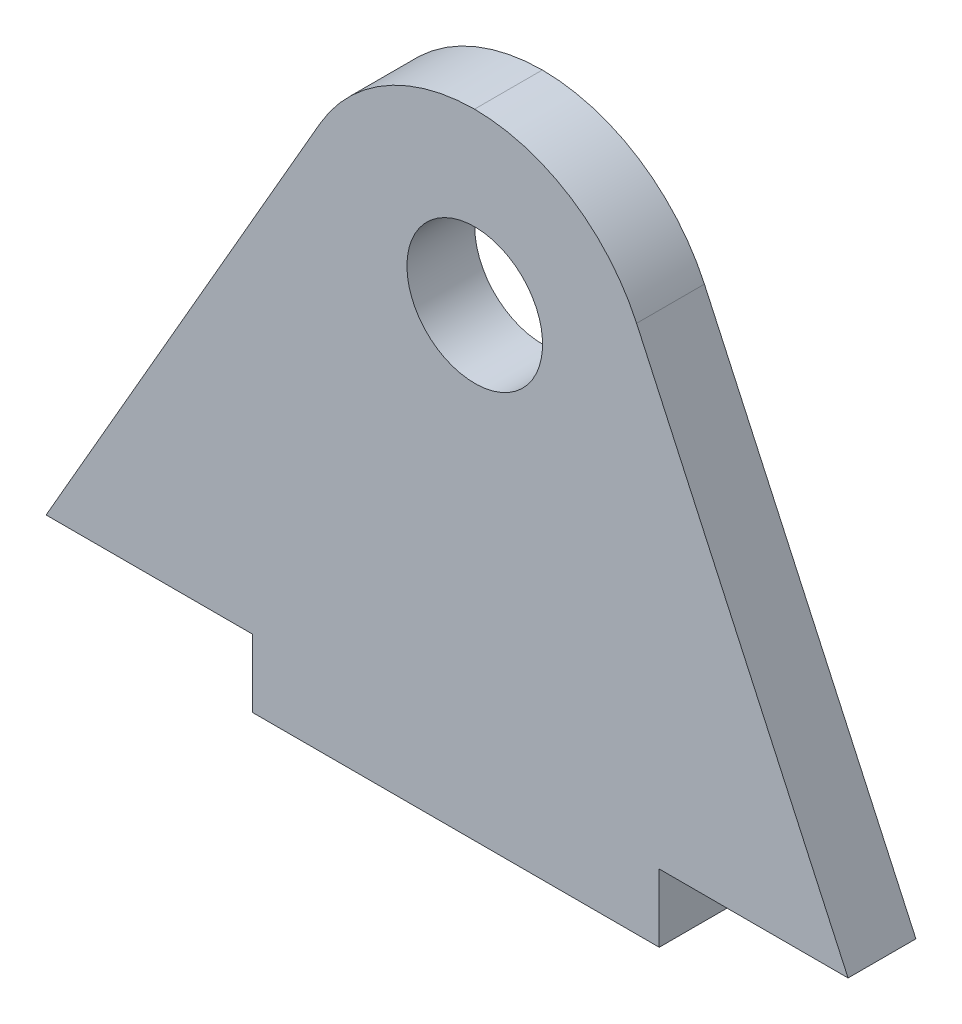
ISO-10303-21;
HEADER;
FILE_DESCRIPTION(('STEP AP214'),'2;1');
FILE_NAME('part.step','',(''),(''),'','','');
FILE_SCHEMA(('AUTOMOTIVE_DESIGN { 1 0 10303 214 1 1 1 1 }'));
ENDSEC;
DATA;
#1=APPLICATION_CONTEXT('core data for automotive mechanical design processes');
#2=APPLICATION_PROTOCOL_DEFINITION('international standard','automotive_design',2000,#1);
#3=PRODUCT_CONTEXT('',#1,'mechanical');
#4=PRODUCT('Part','Part','',(#3));
#5=PRODUCT_RELATED_PRODUCT_CATEGORY('part','',(#4));
#6=PRODUCT_DEFINITION_FORMATION('','',#4);
#7=PRODUCT_DEFINITION_CONTEXT('part definition',#1,'design');
#8=PRODUCT_DEFINITION('design','',#6,#7);
#9=PRODUCT_DEFINITION_SHAPE('','',#8);
#10=(LENGTH_UNIT() NAMED_UNIT(*) SI_UNIT(.MILLI.,.METRE.));
#11=(NAMED_UNIT(*) PLANE_ANGLE_UNIT() SI_UNIT($,.RADIAN.));
#12=(NAMED_UNIT(*) SI_UNIT($,.STERADIAN.) SOLID_ANGLE_UNIT());
#13=UNCERTAINTY_MEASURE_WITH_UNIT(LENGTH_MEASURE(1.E-05),#10,'distance_accuracy_value','');
#14=(GEOMETRIC_REPRESENTATION_CONTEXT(3) GLOBAL_UNCERTAINTY_ASSIGNED_CONTEXT((#13)) GLOBAL_UNIT_ASSIGNED_CONTEXT((#10,
#11,#12)) REPRESENTATION_CONTEXT('',''));
#15=CARTESIAN_POINT('',(0.,0.,0.));
#16=DIRECTION('',(0.,0.,1.));
#17=DIRECTION('',(1.,0.,0.));
#18=AXIS2_PLACEMENT_3D('',#15,#16,#17);
#19=CARTESIAN_POINT('',(-62.178178995026,0.,3.175));
#20=DIRECTION('',(0.,1.,0.));
#21=DIRECTION('',(0.,0.,1.));
#22=AXIS2_PLACEMENT_3D('',#19,#20,#21);
#23=PLANE('',#22);
#24=DIRECTION('',(0.,0.,-1.));
#25=VECTOR('',#24,1.);
#26=CARTESIAN_POINT('',(-52.526178995026,0.,3.175));
#27=LINE('',#26,#25);
#28=CARTESIAN_POINT('',(-52.526178995026,0.,3.175));
#29=VERTEX_POINT('',#28);
#30=CARTESIAN_POINT('',(-52.526178995026,0.,0.));
#31=VERTEX_POINT('',#30);
#32=EDGE_CURVE('E198',#29,#31,#27,.T.);
#33=ORIENTED_EDGE('',*,*,#32,.F.);
#34=DIRECTION('',(1.,0.,0.));
#35=VECTOR('',#34,1.);
#36=CARTESIAN_POINT('',(-62.178178995026,0.,3.175));
#37=LINE('',#36,#35);
#38=CARTESIAN_POINT('',(-62.178178995026,0.,3.175));
#39=VERTEX_POINT('',#38);
#40=EDGE_CURVE('E127',#39,#29,#37,.T.);
#41=ORIENTED_EDGE('',*,*,#40,.F.);
#42=DIRECTION('',(0.,0.,-1.));
#43=VECTOR('',#42,1.);
#44=CARTESIAN_POINT('',(-62.178178995026,0.,3.175));
#45=LINE('',#44,#43);
#46=CARTESIAN_POINT('',(-62.178178995026,0.,0.));
#47=VERTEX_POINT('',#46);
#48=EDGE_CURVE('E131',#39,#47,#45,.T.);
#49=ORIENTED_EDGE('',*,*,#48,.T.);
#50=DIRECTION('',(1.,0.,0.));
#51=VECTOR('',#50,1.);
#52=CARTESIAN_POINT('',(-62.178178995026,0.,0.));
#53=LINE('',#52,#51);
#54=EDGE_CURVE('E128',#47,#31,#53,.T.);
#55=ORIENTED_EDGE('',*,*,#54,.T.);
#56=EDGE_LOOP('',(#33,#41,#49,#55));
#57=FACE_BOUND('',#56,.T.);
#58=ADVANCED_FACE('F34',(#57),#23,.F.);
#59=CARTESIAN_POINT('',(-33.476178995026,0.,3.175));
#60=VERTEX_POINT('',#59);
#61=CARTESIAN_POINT('',(-24.636978995026,0.,3.175));
#62=VERTEX_POINT('',#61);
#63=EDGE_CURVE('E116',#60,#62,#37,.T.);
#64=ORIENTED_EDGE('',*,*,#63,.F.);
#65=DIRECTION('',(0.,0.,-1.));
#66=VECTOR('',#65,1.);
#67=CARTESIAN_POINT('',(-33.476178995026,0.,3.175));
#68=LINE('',#67,#66);
#69=CARTESIAN_POINT('',(-33.476178995026,0.,0.));
#70=VERTEX_POINT('',#69);
#71=EDGE_CURVE('E104',#60,#70,#68,.T.);
#72=ORIENTED_EDGE('',*,*,#71,.T.);
#73=CARTESIAN_POINT('',(-24.636978995026,0.,0.));
#74=VERTEX_POINT('',#73);
#75=EDGE_CURVE('E133',#70,#74,#53,.T.);
#76=ORIENTED_EDGE('',*,*,#75,.T.);
#77=DIRECTION('',(0.,0.,-1.));
#78=VECTOR('',#77,1.);
#79=CARTESIAN_POINT('',(-24.636978995026,0.,3.175));
#80=LINE('',#79,#78);
#81=EDGE_CURVE('E126',#62,#74,#80,.T.);
#82=ORIENTED_EDGE('',*,*,#81,.F.);
#83=EDGE_LOOP('',(#64,#72,#76,#82));
#84=FACE_BOUND('',#83,.T.);
#85=ADVANCED_FACE('F124',(#84),#23,.F.);
#86=CARTESIAN_POINT('',(0.,0.,3.175));
#87=DIRECTION('',(0.,0.,1.));
#88=DIRECTION('',(1.,0.,0.));
#89=AXIS2_PLACEMENT_3D('',#86,#87,#88);
#90=PLANE('',#89);
#91=CARTESIAN_POINT('',(-42.1121789950262,18.542,3.175));
#92=DIRECTION('',(0.,0.,-1.));
#93=DIRECTION('',(-1.,0.,0.));
#94=AXIS2_PLACEMENT_3D('',#91,#92,#93);
#95=CIRCLE('',#94,3.175);
#96=CARTESIAN_POINT('',(-45.2871789950262,18.542,3.175));
#97=VERTEX_POINT('',#96);
#98=EDGE_CURVE('E136',#97,#97,#95,.T.);
#99=ORIENTED_EDGE('',*,*,#98,.T.);
#100=EDGE_LOOP('',(#99));
#101=FACE_BOUND('',#100,.T.);
#102=CARTESIAN_POINT('',(-42.1560142519049,18.0975,3.175));
#103=DIRECTION('',(0.,0.,1.));
#104=DIRECTION('',(1.,0.,0.));
#105=AXIS2_PLACEMENT_3D('',#102,#103,#104);
#106=CIRCLE('',#105,8.382);
#107=CARTESIAN_POINT('',(-34.5367520406581,21.5910322177227,3.175));
#108=VERTEX_POINT('',#107);
#109=CARTESIAN_POINT('',(-42.123622855727,26.4794374131196,3.175));
#110=VERTEX_POINT('',#109);
#111=EDGE_CURVE('E58',#108,#110,#106,.T.);
#112=ORIENTED_EDGE('',*,*,#111,.T.);
#113=CARTESIAN_POINT('',(-42.0912314595492,18.0975,3.175));
#114=DIRECTION('',(0.,0.,1.));
#115=DIRECTION('',(1.,0.,0.));
#116=AXIS2_PLACEMENT_3D('',#113,#114,#115);
#117=CIRCLE('',#116,8.382);
#118=CARTESIAN_POINT('',(-49.3559456360177,22.2786304612769,3.175));
#119=VERTEX_POINT('',#118);
#120=EDGE_CURVE('E43',#110,#119,#117,.T.);
#121=ORIENTED_EDGE('',*,*,#120,.T.);
#122=DIRECTION('',(0.498822531767699,0.866704148946377,0.));
#123=VECTOR('',#122,1.);
#124=CARTESIAN_POINT('',(-46.7067608709964,26.8815889905015,3.175));
#125=LINE('',#124,#123);
#126=EDGE_CURVE('E152',#39,#119,#125,.T.);
#127=ORIENTED_EDGE('',*,*,#126,.F.);
#128=ORIENTED_EDGE('',*,*,#40,.T.);
#129=DIRECTION('',(0.,1.,0.));
#130=VECTOR('',#129,1.);
#131=CARTESIAN_POINT('',(-52.526178995026,-3.175,3.175));
#132=LINE('',#131,#130);
#133=CARTESIAN_POINT('',(-52.526178995026,-3.175,3.175));
#134=VERTEX_POINT('',#133);
#135=EDGE_CURVE('E112',#134,#29,#132,.T.);
#136=ORIENTED_EDGE('',*,*,#135,.F.);
#137=DIRECTION('',(-1.,0.,0.));
#138=VECTOR('',#137,1.);
#139=CARTESIAN_POINT('',(-33.476178995026,-3.175,3.175));
#140=LINE('',#139,#138);
#141=CARTESIAN_POINT('',(-33.476178995026,-3.175,3.175));
#142=VERTEX_POINT('',#141);
#143=EDGE_CURVE('E120',#142,#134,#140,.T.);
#144=ORIENTED_EDGE('',*,*,#143,.F.);
#145=DIRECTION('',(0.,-1.,0.));
#146=VECTOR('',#145,1.);
#147=CARTESIAN_POINT('',(-33.476178995026,0.,3.175));
#148=LINE('',#147,#146);
#149=EDGE_CURVE('E107',#60,#142,#148,.T.);
#150=ORIENTED_EDGE('',*,*,#149,.F.);
#151=ORIENTED_EDGE('',*,*,#63,.T.);
#152=DIRECTION('',(0.416789813615217,-0.909002888480886,0.));
#153=VECTOR('',#152,1.);
#154=CARTESIAN_POINT('',(-20.3571970163338,-9.33404333218952,3.175));
#155=LINE('',#154,#153);
#156=EDGE_CURVE('E160',#108,#62,#155,.T.);
#157=ORIENTED_EDGE('',*,*,#156,.F.);
#158=EDGE_LOOP('',(#112,#121,#127,#128,#136,#144,#150,#151,#157));
#159=FACE_BOUND('',#158,.T.);
#160=ADVANCED_FACE('F115',(#101,#159),#90,.T.);
#161=CARTESIAN_POINT('',(0.,0.,0.));
#162=DIRECTION('',(0.,0.,1.));
#163=DIRECTION('',(1.,0.,0.));
#164=AXIS2_PLACEMENT_3D('',#161,#162,#163);
#165=PLANE('',#164);
#166=CARTESIAN_POINT('',(-42.1121789950262,18.542,0.));
#167=DIRECTION('',(0.,0.,-1.));
#168=DIRECTION('',(-1.,0.,0.));
#169=AXIS2_PLACEMENT_3D('',#166,#167,#168);
#170=CIRCLE('',#169,3.17499999999999);
#171=CARTESIAN_POINT('',(-45.2871789950262,18.542,0.));
#172=VERTEX_POINT('',#171);
#173=EDGE_CURVE('E180',#172,#172,#170,.T.);
#174=ORIENTED_EDGE('',*,*,#173,.F.);
#175=EDGE_LOOP('',(#174));
#176=FACE_BOUND('',#175,.T.);
#177=DIRECTION('',(0.498822531767699,0.866704148946377,0.));
#178=VECTOR('',#177,1.);
#179=CARTESIAN_POINT('',(-46.7067608709964,26.8815889905015,0.));
#180=LINE('',#179,#178);
#181=CARTESIAN_POINT('',(-49.3559456360177,22.2786304612769,0.));
#182=VERTEX_POINT('',#181);
#183=EDGE_CURVE('E169',#47,#182,#180,.T.);
#184=ORIENTED_EDGE('',*,*,#183,.T.);
#185=CARTESIAN_POINT('',(-42.0912314595492,18.0975,0.));
#186=DIRECTION('',(0.,0.,1.));
#187=DIRECTION('',(1.,0.,0.));
#188=AXIS2_PLACEMENT_3D('',#185,#186,#187);
#189=CIRCLE('',#188,8.382);
#190=CARTESIAN_POINT('',(-42.123622855727,26.4794374131196,0.));
#191=VERTEX_POINT('',#190);
#192=EDGE_CURVE('E146',#182,#191,#189,.F.);
#193=ORIENTED_EDGE('',*,*,#192,.T.);
#194=CARTESIAN_POINT('',(-42.1560142519049,18.0975,0.));
#195=DIRECTION('',(0.,0.,1.));
#196=DIRECTION('',(1.,0.,0.));
#197=AXIS2_PLACEMENT_3D('',#194,#195,#196);
#198=CIRCLE('',#197,8.382);
#199=CARTESIAN_POINT('',(-34.5367520406581,21.5910322177227,0.));
#200=VERTEX_POINT('',#199);
#201=EDGE_CURVE('E144',#191,#200,#198,.F.);
#202=ORIENTED_EDGE('',*,*,#201,.T.);
#203=DIRECTION('',(0.416789813615217,-0.909002888480886,0.));
#204=VECTOR('',#203,1.);
#205=CARTESIAN_POINT('',(-20.3571970163338,-9.33404333218952,0.));
#206=LINE('',#205,#204);
#207=EDGE_CURVE('E174',#200,#74,#206,.T.);
#208=ORIENTED_EDGE('',*,*,#207,.T.);
#209=ORIENTED_EDGE('',*,*,#75,.F.);
#210=DIRECTION('',(0.,-1.,0.));
#211=VECTOR('',#210,1.);
#212=CARTESIAN_POINT('',(-33.476178995026,0.,0.));
#213=LINE('',#212,#211);
#214=CARTESIAN_POINT('',(-33.476178995026,-3.175,0.));
#215=VERTEX_POINT('',#214);
#216=EDGE_CURVE('E50',#70,#215,#213,.T.);
#217=ORIENTED_EDGE('',*,*,#216,.T.);
#218=DIRECTION('',(-1.,0.,0.));
#219=VECTOR('',#218,1.);
#220=CARTESIAN_POINT('',(-33.476178995026,-3.175,0.));
#221=LINE('',#220,#219);
#222=CARTESIAN_POINT('',(-52.526178995026,-3.175,0.));
#223=VERTEX_POINT('',#222);
#224=EDGE_CURVE('E190',#215,#223,#221,.T.);
#225=ORIENTED_EDGE('',*,*,#224,.T.);
#226=DIRECTION('',(0.,1.,0.));
#227=VECTOR('',#226,1.);
#228=CARTESIAN_POINT('',(-52.526178995026,-3.175,0.));
#229=LINE('',#228,#227);
#230=EDGE_CURVE('E121',#223,#31,#229,.T.);
#231=ORIENTED_EDGE('',*,*,#230,.T.);
#232=ORIENTED_EDGE('',*,*,#54,.F.);
#233=EDGE_LOOP('',(#184,#193,#202,#208,#209,#217,#225,#231,#232));
#234=FACE_BOUND('',#233,.T.);
#235=ADVANCED_FACE('F165',(#176,#234),#165,.F.);
#236=CARTESIAN_POINT('',(-42.1121789950262,18.542,0.));
#237=DIRECTION('',(0.,0.,-1.));
#238=DIRECTION('',(-1.,0.,0.));
#239=AXIS2_PLACEMENT_3D('',#236,#237,#238);
#240=CYLINDRICAL_SURFACE('',#239,3.17499999999999);
#241=ORIENTED_EDGE('',*,*,#98,.F.);
#242=EDGE_LOOP('',(#241));
#243=FACE_BOUND('',#242,.T.);
#244=ORIENTED_EDGE('',*,*,#173,.T.);
#245=EDGE_LOOP('',(#244));
#246=FACE_BOUND('',#245,.T.);
#247=ADVANCED_FACE('F227',(#243,#246),#240,.F.);
#248=CARTESIAN_POINT('',(-20.3571970163338,-9.33404333218952,3.175));
#249=DIRECTION('',(0.909002888480886,0.416789813615217,0.));
#250=DIRECTION('',(-0.416789813615217,0.909002888480886,0.));
#251=AXIS2_PLACEMENT_3D('',#248,#249,#250);
#252=PLANE('',#251);
#253=ORIENTED_EDGE('',*,*,#207,.F.);
#254=DIRECTION('',(0.,0.,-1.));
#255=VECTOR('',#254,1.);
#256=CARTESIAN_POINT('',(-34.5367520406581,21.5910322177227,3.175));
#257=LINE('',#256,#255);
#258=EDGE_CURVE('E11',#200,#108,#257,.F.);
#259=ORIENTED_EDGE('',*,*,#258,.T.);
#260=ORIENTED_EDGE('',*,*,#156,.T.);
#261=ORIENTED_EDGE('',*,*,#81,.T.);
#262=EDGE_LOOP('',(#253,#259,#260,#261));
#263=FACE_BOUND('',#262,.T.);
#264=ADVANCED_FACE('F173',(#263),#252,.T.);
#265=CARTESIAN_POINT('',(-46.7067608709964,26.8815889905015,3.175));
#266=DIRECTION('',(-0.866704148946377,0.498822531767699,0.));
#267=DIRECTION('',(-0.498822531767699,-0.866704148946377,0.));
#268=AXIS2_PLACEMENT_3D('',#265,#266,#267);
#269=PLANE('',#268);
#270=ORIENTED_EDGE('',*,*,#126,.T.);
#271=DIRECTION('',(0.,0.,-1.));
#272=VECTOR('',#271,1.);
#273=CARTESIAN_POINT('',(-49.3559456360177,22.2786304612768,3.175));
#274=LINE('',#273,#272);
#275=EDGE_CURVE('E141',#119,#182,#274,.T.);
#276=ORIENTED_EDGE('',*,*,#275,.T.);
#277=ORIENTED_EDGE('',*,*,#183,.F.);
#278=ORIENTED_EDGE('',*,*,#48,.F.);
#279=EDGE_LOOP('',(#270,#276,#277,#278));
#280=FACE_BOUND('',#279,.T.);
#281=ADVANCED_FACE('F158',(#280),#269,.T.);
#282=CARTESIAN_POINT('',(-42.1560142519049,18.0975,3.175));
#283=DIRECTION('',(0.,0.,-1.));
#284=DIRECTION('',(-1.,0.,0.));
#285=AXIS2_PLACEMENT_3D('',#282,#283,#284);
#286=CYLINDRICAL_SURFACE('',#285,8.382);
#287=DIRECTION('',(0.,0.,-1.));
#288=VECTOR('',#287,1.);
#289=CARTESIAN_POINT('',(-42.123622855727,26.4794374131196,1.5875));
#290=LINE('',#289,#288);
#291=EDGE_CURVE('E38',#110,#191,#290,.T.);
#292=ORIENTED_EDGE('',*,*,#291,.F.);
#293=ORIENTED_EDGE('',*,*,#111,.F.);
#294=ORIENTED_EDGE('',*,*,#258,.F.);
#295=ORIENTED_EDGE('',*,*,#201,.F.);
#296=EDGE_LOOP('',(#292,#293,#294,#295));
#297=FACE_BOUND('',#296,.T.);
#298=ADVANCED_FACE('F36',(#297),#286,.T.);
#299=CARTESIAN_POINT('',(-42.0912314595492,18.0975,3.175));
#300=DIRECTION('',(0.,0.,-1.));
#301=DIRECTION('',(-1.,0.,0.));
#302=AXIS2_PLACEMENT_3D('',#299,#300,#301);
#303=CYLINDRICAL_SURFACE('',#302,8.382);
#304=ORIENTED_EDGE('',*,*,#120,.F.);
#305=ORIENTED_EDGE('',*,*,#291,.T.);
#306=ORIENTED_EDGE('',*,*,#192,.F.);
#307=ORIENTED_EDGE('',*,*,#275,.F.);
#308=EDGE_LOOP('',(#304,#305,#306,#307));
#309=FACE_BOUND('',#308,.T.);
#310=ADVANCED_FACE('F162',(#309),#303,.T.);
#311=CARTESIAN_POINT('',(-52.526178995026,-3.175,3.175));
#312=DIRECTION('',(-1.,0.,0.));
#313=DIRECTION('',(0.,-1.,0.));
#314=AXIS2_PLACEMENT_3D('',#311,#312,#313);
#315=PLANE('',#314);
#316=ORIENTED_EDGE('',*,*,#230,.F.);
#317=DIRECTION('',(0.,0.,-1.));
#318=VECTOR('',#317,1.);
#319=CARTESIAN_POINT('',(-52.526178995026,-3.175,3.175));
#320=LINE('',#319,#318);
#321=EDGE_CURVE('E200',#134,#223,#320,.T.);
#322=ORIENTED_EDGE('',*,*,#321,.F.);
#323=ORIENTED_EDGE('',*,*,#135,.T.);
#324=ORIENTED_EDGE('',*,*,#32,.T.);
#325=EDGE_LOOP('',(#316,#322,#323,#324));
#326=FACE_BOUND('',#325,.T.);
#327=ADVANCED_FACE('F204',(#326),#315,.T.);
#328=CARTESIAN_POINT('',(-33.476178995026,-3.175,3.175));
#329=DIRECTION('',(0.,-1.,0.));
#330=DIRECTION('',(0.,0.,-1.));
#331=AXIS2_PLACEMENT_3D('',#328,#329,#330);
#332=PLANE('',#331);
#333=ORIENTED_EDGE('',*,*,#224,.F.);
#334=DIRECTION('',(0.,0.,-1.));
#335=VECTOR('',#334,1.);
#336=CARTESIAN_POINT('',(-33.476178995026,-3.175,3.175));
#337=LINE('',#336,#335);
#338=EDGE_CURVE('E111',#142,#215,#337,.T.);
#339=ORIENTED_EDGE('',*,*,#338,.F.);
#340=ORIENTED_EDGE('',*,*,#143,.T.);
#341=ORIENTED_EDGE('',*,*,#321,.T.);
#342=EDGE_LOOP('',(#333,#339,#340,#341));
#343=FACE_BOUND('',#342,.T.);
#344=ADVANCED_FACE('F202',(#343),#332,.T.);
#345=CARTESIAN_POINT('',(-33.476178995026,0.,3.175));
#346=DIRECTION('',(1.,0.,0.));
#347=DIRECTION('',(0.,0.,-1.));
#348=AXIS2_PLACEMENT_3D('',#345,#346,#347);
#349=PLANE('',#348);
#350=ORIENTED_EDGE('',*,*,#216,.F.);
#351=ORIENTED_EDGE('',*,*,#71,.F.);
#352=ORIENTED_EDGE('',*,*,#149,.T.);
#353=ORIENTED_EDGE('',*,*,#338,.T.);
#354=EDGE_LOOP('',(#350,#351,#352,#353));
#355=FACE_BOUND('',#354,.T.);
#356=ADVANCED_FACE('F106',(#355),#349,.T.);
#357=CLOSED_SHELL('',(#58,#85,#160,#235,#247,#264,#281,#298,#310,#327,#344,#356));
#358=MANIFOLD_SOLID_BREP('B2',#357);
#359=ADVANCED_BREP_SHAPE_REPRESENTATION('',(#18,#358),#14);
#360=SHAPE_DEFINITION_REPRESENTATION(#9,#359);
ENDSEC;
END-ISO-10303-21;
